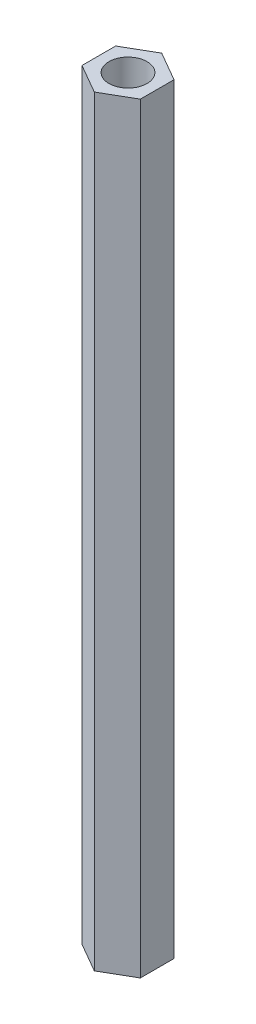
ISO-10303-21;
HEADER;
FILE_DESCRIPTION(('STEP AP214'),'2;1');
FILE_NAME('part.step','',(''),(''),'','','');
FILE_SCHEMA(('AUTOMOTIVE_DESIGN { 1 0 10303 214 1 1 1 1 }'));
ENDSEC;
DATA;
#1=APPLICATION_CONTEXT('core data for automotive mechanical design processes');
#2=APPLICATION_PROTOCOL_DEFINITION('international standard','automotive_design',2000,#1);
#3=PRODUCT_CONTEXT('',#1,'mechanical');
#4=PRODUCT('Part','Part','',(#3));
#5=PRODUCT_RELATED_PRODUCT_CATEGORY('part','',(#4));
#6=PRODUCT_DEFINITION_FORMATION('','',#4);
#7=PRODUCT_DEFINITION_CONTEXT('part definition',#1,'design');
#8=PRODUCT_DEFINITION('design','',#6,#7);
#9=PRODUCT_DEFINITION_SHAPE('','',#8);
#10=(LENGTH_UNIT() NAMED_UNIT(*) SI_UNIT(.MILLI.,.METRE.));
#11=(NAMED_UNIT(*) PLANE_ANGLE_UNIT() SI_UNIT($,.RADIAN.));
#12=(NAMED_UNIT(*) SI_UNIT($,.STERADIAN.) SOLID_ANGLE_UNIT());
#13=UNCERTAINTY_MEASURE_WITH_UNIT(LENGTH_MEASURE(1.E-05),#10,'distance_accuracy_value','');
#14=(GEOMETRIC_REPRESENTATION_CONTEXT(3) GLOBAL_UNCERTAINTY_ASSIGNED_CONTEXT((#13)) GLOBAL_UNIT_ASSIGNED_CONTEXT((#10,
#11,#12)) REPRESENTATION_CONTEXT('',''));
#15=CARTESIAN_POINT('',(0.,0.,0.));
#16=DIRECTION('',(0.,0.,1.));
#17=DIRECTION('',(1.,0.,0.));
#18=AXIS2_PLACEMENT_3D('',#15,#16,#17);
#19=CARTESIAN_POINT('',(0.,60.,0.));
#20=DIRECTION('',(0.,1.,0.));
#21=DIRECTION('',(0.,0.,1.));
#22=AXIS2_PLACEMENT_3D('',#19,#20,#21);
#23=PLANE('',#22);
#24=DIRECTION('',(-0.866025403784442,0.,-0.499999999999995));
#25=VECTOR('',#24,1.);
#26=CARTESIAN_POINT('',(2.29999999999999,60.,-1.32790561913617));
#27=LINE('',#26,#25);
#28=CARTESIAN_POINT('',(2.29999999999999,60.,-1.32790561913617));
#29=VERTEX_POINT('',#28);
#30=CARTESIAN_POINT('',(0.,60.,-2.65581123827228));
#31=VERTEX_POINT('',#30);
#32=EDGE_CURVE('E135',#29,#31,#27,.T.);
#33=ORIENTED_EDGE('',*,*,#32,.T.);
#34=DIRECTION('',(-0.866025403784438,0.,0.500000000000001));
#35=VECTOR('',#34,1.);
#36=CARTESIAN_POINT('',(0.,60.,-2.65581123827228));
#37=LINE('',#36,#35);
#38=CARTESIAN_POINT('',(-2.3,60.,-1.32790561913613));
#39=VERTEX_POINT('',#38);
#40=EDGE_CURVE('E93',#31,#39,#37,.T.);
#41=ORIENTED_EDGE('',*,*,#40,.T.);
#42=DIRECTION('',(0.,0.,1.));
#43=VECTOR('',#42,1.);
#44=CARTESIAN_POINT('',(-2.3,60.,-1.32790561913613));
#45=LINE('',#44,#43);
#46=CARTESIAN_POINT('',(-2.3,60.,1.32790561913615));
#47=VERTEX_POINT('',#46);
#48=EDGE_CURVE('E106',#39,#47,#45,.T.);
#49=ORIENTED_EDGE('',*,*,#48,.T.);
#50=DIRECTION('',(0.866025403784442,0.,0.499999999999995));
#51=VECTOR('',#50,1.);
#52=CARTESIAN_POINT('',(-2.3,60.,1.32790561913615));
#53=LINE('',#52,#51);
#54=CARTESIAN_POINT('',(0.,60.,2.65581123827228));
#55=VERTEX_POINT('',#54);
#56=EDGE_CURVE('E100',#47,#55,#53,.T.);
#57=ORIENTED_EDGE('',*,*,#56,.T.);
#58=DIRECTION('',(0.866025403784435,0.,-0.500000000000007));
#59=VECTOR('',#58,1.);
#60=CARTESIAN_POINT('',(0.,60.,2.65581123827228));
#61=LINE('',#60,#59);
#62=CARTESIAN_POINT('',(2.30000000000001,60.,1.32790561913612));
#63=VERTEX_POINT('',#62);
#64=EDGE_CURVE('E104',#55,#63,#61,.T.);
#65=ORIENTED_EDGE('',*,*,#64,.T.);
#66=DIRECTION('',(0.,0.,-1.));
#67=VECTOR('',#66,1.);
#68=CARTESIAN_POINT('',(2.30000000000001,60.,1.32790561913612));
#69=LINE('',#68,#67);
#70=EDGE_CURVE('E56',#63,#29,#69,.T.);
#71=ORIENTED_EDGE('',*,*,#70,.T.);
#72=EDGE_LOOP('',(#33,#41,#49,#57,#65,#71));
#73=FACE_BOUND('',#72,.T.);
#74=CARTESIAN_POINT('',(0.,60.,0.));
#75=DIRECTION('',(0.,1.,0.));
#76=DIRECTION('',(0.,0.,1.));
#77=AXIS2_PLACEMENT_3D('',#74,#75,#76);
#78=CIRCLE('',#77,1.5);
#79=CARTESIAN_POINT('',(0.,60.,1.5));
#80=VERTEX_POINT('',#79);
#81=EDGE_CURVE('E128',#80,#80,#78,.T.);
#82=ORIENTED_EDGE('',*,*,#81,.F.);
#83=EDGE_LOOP('',(#82));
#84=FACE_BOUND('',#83,.T.);
#85=ADVANCED_FACE('F39',(#73,#84),#23,.T.);
#86=CARTESIAN_POINT('',(0.,0.,0.));
#87=DIRECTION('',(0.,1.,0.));
#88=DIRECTION('',(0.,0.,1.));
#89=AXIS2_PLACEMENT_3D('',#86,#87,#88);
#90=PLANE('',#89);
#91=DIRECTION('',(-0.866025403784442,0.,-0.499999999999995));
#92=VECTOR('',#91,1.);
#93=CARTESIAN_POINT('',(2.29999999999999,0.,-1.32790561913617));
#94=LINE('',#93,#92);
#95=CARTESIAN_POINT('',(2.29999999999999,0.,-1.32790561913617));
#96=VERTEX_POINT('',#95);
#97=CARTESIAN_POINT('',(0.,0.,-2.65581123827228));
#98=VERTEX_POINT('',#97);
#99=EDGE_CURVE('E124',#96,#98,#94,.T.);
#100=ORIENTED_EDGE('',*,*,#99,.F.);
#101=DIRECTION('',(0.,0.,-1.));
#102=VECTOR('',#101,1.);
#103=CARTESIAN_POINT('',(2.30000000000001,0.,1.32790561913612));
#104=LINE('',#103,#102);
#105=CARTESIAN_POINT('',(2.30000000000001,0.,1.32790561913612));
#106=VERTEX_POINT('',#105);
#107=EDGE_CURVE('E85',#106,#96,#104,.T.);
#108=ORIENTED_EDGE('',*,*,#107,.F.);
#109=DIRECTION('',(0.866025403784435,0.,-0.500000000000007));
#110=VECTOR('',#109,1.);
#111=CARTESIAN_POINT('',(0.,0.,2.65581123827228));
#112=LINE('',#111,#110);
#113=CARTESIAN_POINT('',(0.,0.,2.65581123827228));
#114=VERTEX_POINT('',#113);
#115=EDGE_CURVE('E79',#114,#106,#112,.T.);
#116=ORIENTED_EDGE('',*,*,#115,.F.);
#117=DIRECTION('',(0.866025403784442,0.,0.499999999999995));
#118=VECTOR('',#117,1.);
#119=CARTESIAN_POINT('',(-2.3,0.,1.32790561913615));
#120=LINE('',#119,#118);
#121=CARTESIAN_POINT('',(-2.3,0.,1.32790561913615));
#122=VERTEX_POINT('',#121);
#123=EDGE_CURVE('E114',#122,#114,#120,.T.);
#124=ORIENTED_EDGE('',*,*,#123,.F.);
#125=DIRECTION('',(0.,0.,1.));
#126=VECTOR('',#125,1.);
#127=CARTESIAN_POINT('',(-2.3,0.,-1.32790561913613));
#128=LINE('',#127,#126);
#129=CARTESIAN_POINT('',(-2.3,0.,-1.32790561913613));
#130=VERTEX_POINT('',#129);
#131=EDGE_CURVE('E130',#130,#122,#128,.T.);
#132=ORIENTED_EDGE('',*,*,#131,.F.);
#133=DIRECTION('',(-0.866025403784438,0.,0.500000000000001));
#134=VECTOR('',#133,1.);
#135=CARTESIAN_POINT('',(0.,0.,-2.65581123827228));
#136=LINE('',#135,#134);
#137=EDGE_CURVE('E127',#98,#130,#136,.T.);
#138=ORIENTED_EDGE('',*,*,#137,.F.);
#139=EDGE_LOOP('',(#100,#108,#116,#124,#132,#138));
#140=FACE_BOUND('',#139,.T.);
#141=CARTESIAN_POINT('',(0.,0.,0.));
#142=DIRECTION('',(0.,1.,0.));
#143=DIRECTION('',(0.,0.,1.));
#144=AXIS2_PLACEMENT_3D('',#141,#142,#143);
#145=CIRCLE('',#144,1.5);
#146=CARTESIAN_POINT('',(0.,0.,1.5));
#147=VERTEX_POINT('',#146);
#148=EDGE_CURVE('E246',#147,#147,#145,.T.);
#149=ORIENTED_EDGE('',*,*,#148,.T.);
#150=EDGE_LOOP('',(#149));
#151=FACE_BOUND('',#150,.T.);
#152=ADVANCED_FACE('F144',(#140,#151),#90,.F.);
#153=CARTESIAN_POINT('',(2.29999999999999,60.,-1.32790561913617));
#154=DIRECTION('',(-0.499999999999995,0.,0.866025403784442));
#155=DIRECTION('',(0.866025403784442,0.,0.499999999999995));
#156=AXIS2_PLACEMENT_3D('',#153,#154,#155);
#157=PLANE('',#156);
#158=ORIENTED_EDGE('',*,*,#99,.T.);
#159=DIRECTION('',(0.,-1.,0.));
#160=VECTOR('',#159,1.);
#161=CARTESIAN_POINT('',(0.,60.,-2.65581123827228));
#162=LINE('',#161,#160);
#163=EDGE_CURVE('E11',#31,#98,#162,.T.);
#164=ORIENTED_EDGE('',*,*,#163,.F.);
#165=ORIENTED_EDGE('',*,*,#32,.F.);
#166=DIRECTION('',(0.,-1.,0.));
#167=VECTOR('',#166,1.);
#168=CARTESIAN_POINT('',(2.29999999999999,60.,-1.32790561913617));
#169=LINE('',#168,#167);
#170=EDGE_CURVE('E120',#29,#96,#169,.T.);
#171=ORIENTED_EDGE('',*,*,#170,.T.);
#172=EDGE_LOOP('',(#158,#164,#165,#171));
#173=FACE_BOUND('',#172,.T.);
#174=ADVANCED_FACE('F41',(#173),#157,.F.);
#175=CARTESIAN_POINT('',(0.,60.,-2.65581123827228));
#176=DIRECTION('',(0.500000000000001,0.,0.866025403784438));
#177=DIRECTION('',(0.866025403784438,0.,-0.500000000000001));
#178=AXIS2_PLACEMENT_3D('',#175,#176,#177);
#179=PLANE('',#178);
#180=ORIENTED_EDGE('',*,*,#137,.T.);
#181=DIRECTION('',(0.,-1.,0.));
#182=VECTOR('',#181,1.);
#183=CARTESIAN_POINT('',(-2.3,60.,-1.32790561913613));
#184=LINE('',#183,#182);
#185=EDGE_CURVE('E48',#39,#130,#184,.T.);
#186=ORIENTED_EDGE('',*,*,#185,.F.);
#187=ORIENTED_EDGE('',*,*,#40,.F.);
#188=ORIENTED_EDGE('',*,*,#163,.T.);
#189=EDGE_LOOP('',(#180,#186,#187,#188));
#190=FACE_BOUND('',#189,.T.);
#191=ADVANCED_FACE('F169',(#190),#179,.F.);
#192=CARTESIAN_POINT('',(-2.3,60.,-1.32790561913613));
#193=DIRECTION('',(1.,0.,0.));
#194=DIRECTION('',(0.,0.,-1.));
#195=AXIS2_PLACEMENT_3D('',#192,#193,#194);
#196=PLANE('',#195);
#197=ORIENTED_EDGE('',*,*,#131,.T.);
#198=DIRECTION('',(0.,-1.,0.));
#199=VECTOR('',#198,1.);
#200=CARTESIAN_POINT('',(-2.3,60.,1.32790561913615));
#201=LINE('',#200,#199);
#202=EDGE_CURVE('E115',#47,#122,#201,.T.);
#203=ORIENTED_EDGE('',*,*,#202,.F.);
#204=ORIENTED_EDGE('',*,*,#48,.F.);
#205=ORIENTED_EDGE('',*,*,#185,.T.);
#206=EDGE_LOOP('',(#197,#203,#204,#205));
#207=FACE_BOUND('',#206,.T.);
#208=ADVANCED_FACE('F141',(#207),#196,.F.);
#209=CARTESIAN_POINT('',(-2.3,60.,1.32790561913615));
#210=DIRECTION('',(0.499999999999995,0.,-0.866025403784442));
#211=DIRECTION('',(-0.866025403784442,0.,-0.499999999999995));
#212=AXIS2_PLACEMENT_3D('',#209,#210,#211);
#213=PLANE('',#212);
#214=ORIENTED_EDGE('',*,*,#123,.T.);
#215=DIRECTION('',(0.,-1.,0.));
#216=VECTOR('',#215,1.);
#217=CARTESIAN_POINT('',(0.,60.,2.65581123827228));
#218=LINE('',#217,#216);
#219=EDGE_CURVE('E111',#55,#114,#218,.T.);
#220=ORIENTED_EDGE('',*,*,#219,.F.);
#221=ORIENTED_EDGE('',*,*,#56,.F.);
#222=ORIENTED_EDGE('',*,*,#202,.T.);
#223=EDGE_LOOP('',(#214,#220,#221,#222));
#224=FACE_BOUND('',#223,.T.);
#225=ADVANCED_FACE('F112',(#224),#213,.F.);
#226=CARTESIAN_POINT('',(0.,60.,2.65581123827228));
#227=DIRECTION('',(-0.500000000000007,0.,-0.866025403784435));
#228=DIRECTION('',(-0.866025403784435,0.,0.500000000000007));
#229=AXIS2_PLACEMENT_3D('',#226,#227,#228);
#230=PLANE('',#229);
#231=ORIENTED_EDGE('',*,*,#115,.T.);
#232=DIRECTION('',(0.,-1.,0.));
#233=VECTOR('',#232,1.);
#234=CARTESIAN_POINT('',(2.30000000000001,60.,1.32790561913612));
#235=LINE('',#234,#233);
#236=EDGE_CURVE('E116',#63,#106,#235,.T.);
#237=ORIENTED_EDGE('',*,*,#236,.F.);
#238=ORIENTED_EDGE('',*,*,#64,.F.);
#239=ORIENTED_EDGE('',*,*,#219,.T.);
#240=EDGE_LOOP('',(#231,#237,#238,#239));
#241=FACE_BOUND('',#240,.T.);
#242=ADVANCED_FACE('F118',(#241),#230,.F.);
#243=CARTESIAN_POINT('',(2.30000000000001,60.,1.32790561913612));
#244=DIRECTION('',(-1.,0.,0.));
#245=DIRECTION('',(0.,0.,1.));
#246=AXIS2_PLACEMENT_3D('',#243,#244,#245);
#247=PLANE('',#246);
#248=ORIENTED_EDGE('',*,*,#107,.T.);
#249=ORIENTED_EDGE('',*,*,#170,.F.);
#250=ORIENTED_EDGE('',*,*,#70,.F.);
#251=ORIENTED_EDGE('',*,*,#236,.T.);
#252=EDGE_LOOP('',(#248,#249,#250,#251));
#253=FACE_BOUND('',#252,.T.);
#254=ADVANCED_FACE('F149',(#253),#247,.F.);
#255=CARTESIAN_POINT('',(0.,60.,0.));
#256=DIRECTION('',(0.,-1.,0.));
#257=DIRECTION('',(0.,0.,-1.));
#258=AXIS2_PLACEMENT_3D('',#255,#256,#257);
#259=CYLINDRICAL_SURFACE('',#258,1.5);
#260=ORIENTED_EDGE('',*,*,#81,.T.);
#261=EDGE_LOOP('',(#260));
#262=FACE_BOUND('',#261,.T.);
#263=ORIENTED_EDGE('',*,*,#148,.F.);
#264=EDGE_LOOP('',(#263));
#265=FACE_BOUND('',#264,.T.);
#266=ADVANCED_FACE('F151',(#262,#265),#259,.F.);
#267=CLOSED_SHELL('',(#85,#152,#174,#191,#208,#225,#242,#254,#266));
#268=MANIFOLD_SOLID_BREP('B2',#267);
#269=ADVANCED_BREP_SHAPE_REPRESENTATION('',(#18,#268),#14);
#270=SHAPE_DEFINITION_REPRESENTATION(#9,#269);
ENDSEC;
END-ISO-10303-21;
